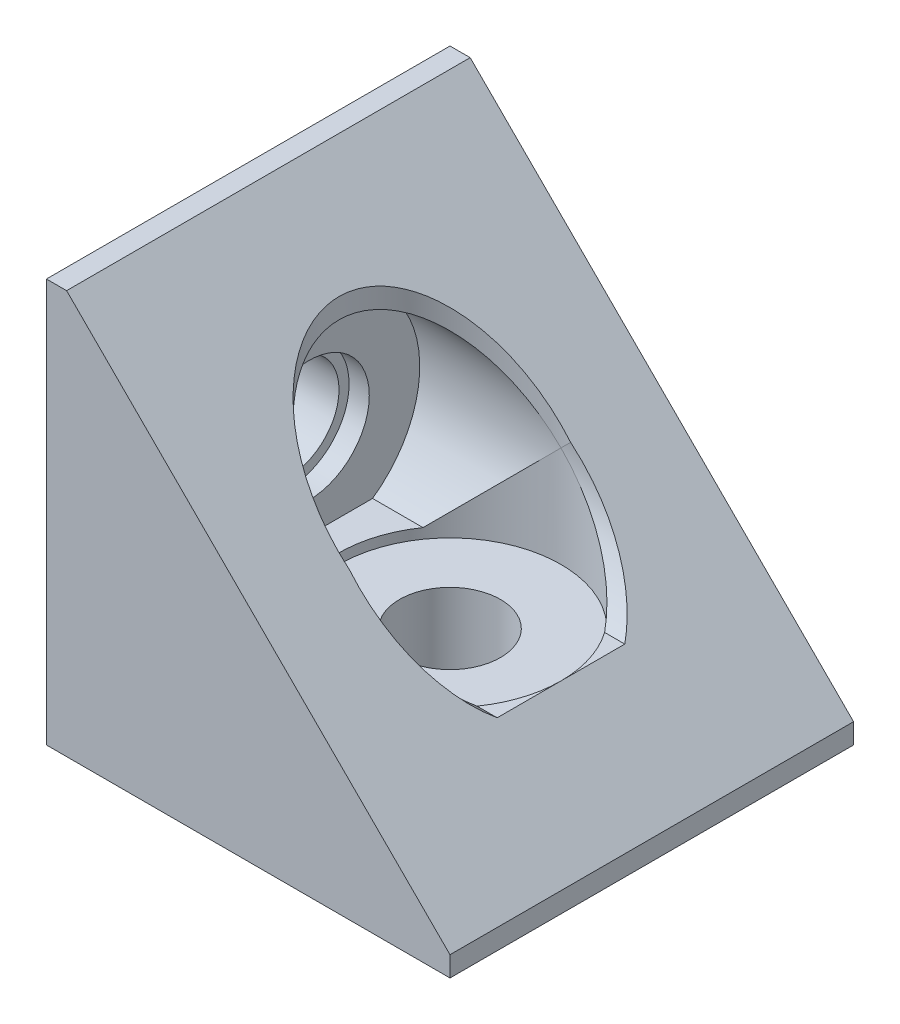
ISO-10303-21;
HEADER;
FILE_DESCRIPTION(('STEP AP214'),'2;1');
FILE_NAME('part.step','',(''),(''),'','','');
FILE_SCHEMA(('AUTOMOTIVE_DESIGN { 1 0 10303 214 1 1 1 1 }'));
ENDSEC;
DATA;
#1=APPLICATION_CONTEXT('core data for automotive mechanical design processes');
#2=APPLICATION_PROTOCOL_DEFINITION('international standard','automotive_design',2000,#1);
#3=PRODUCT_CONTEXT('',#1,'mechanical');
#4=PRODUCT('Part','Part','',(#3));
#5=PRODUCT_RELATED_PRODUCT_CATEGORY('part','',(#4));
#6=PRODUCT_DEFINITION_FORMATION('','',#4);
#7=PRODUCT_DEFINITION_CONTEXT('part definition',#1,'design');
#8=PRODUCT_DEFINITION('design','',#6,#7);
#9=PRODUCT_DEFINITION_SHAPE('','',#8);
#10=(LENGTH_UNIT() NAMED_UNIT(*) SI_UNIT(.MILLI.,.METRE.));
#11=(NAMED_UNIT(*) PLANE_ANGLE_UNIT() SI_UNIT($,.RADIAN.));
#12=(NAMED_UNIT(*) SI_UNIT($,.STERADIAN.) SOLID_ANGLE_UNIT());
#13=UNCERTAINTY_MEASURE_WITH_UNIT(LENGTH_MEASURE(1.E-05),#10,'distance_accuracy_value','');
#14=(GEOMETRIC_REPRESENTATION_CONTEXT(3) GLOBAL_UNCERTAINTY_ASSIGNED_CONTEXT((#13)) GLOBAL_UNIT_ASSIGNED_CONTEXT((#10,
#11,#12)) REPRESENTATION_CONTEXT('',''));
#15=CARTESIAN_POINT('',(0.,0.,0.));
#16=DIRECTION('',(0.,0.,1.));
#17=DIRECTION('',(1.,0.,0.));
#18=AXIS2_PLACEMENT_3D('',#15,#16,#17);
#19=CARTESIAN_POINT('',(0.,20.,20.));
#20=DIRECTION('',(1.,0.,0.));
#21=DIRECTION('',(0.,1.,0.));
#22=AXIS2_PLACEMENT_3D('',#19,#20,#21);
#23=PLANE('',#22);
#24=CARTESIAN_POINT('',(0.,10.,10.));
#25=DIRECTION('',(1.,0.,0.));
#26=DIRECTION('',(0.,1.,0.));
#27=AXIS2_PLACEMENT_3D('',#24,#25,#26);
#28=CIRCLE('',#27,2.5);
#29=CARTESIAN_POINT('',(0.,12.5,10.));
#30=VERTEX_POINT('',#29);
#31=EDGE_CURVE('E43',#30,#30,#28,.T.);
#32=ORIENTED_EDGE('',*,*,#31,.T.);
#33=EDGE_LOOP('',(#32));
#34=FACE_BOUND('',#33,.T.);
#35=DIRECTION('',(0.,-1.,0.));
#36=VECTOR('',#35,1.);
#37=CARTESIAN_POINT('',(0.,20.,0.));
#38=LINE('',#37,#36);
#39=CARTESIAN_POINT('',(0.,20.,0.));
#40=VERTEX_POINT('',#39);
#41=CARTESIAN_POINT('',(0.,0.,0.));
#42=VERTEX_POINT('',#41);
#43=EDGE_CURVE('E176',#40,#42,#38,.T.);
#44=ORIENTED_EDGE('',*,*,#43,.T.);
#45=DIRECTION('',(0.,0.,-1.));
#46=VECTOR('',#45,1.);
#47=CARTESIAN_POINT('',(0.,0.,20.));
#48=LINE('',#47,#46);
#49=CARTESIAN_POINT('',(0.,0.,20.));
#50=VERTEX_POINT('',#49);
#51=EDGE_CURVE('E197',#50,#42,#48,.T.);
#52=ORIENTED_EDGE('',*,*,#51,.F.);
#53=DIRECTION('',(0.,-1.,0.));
#54=VECTOR('',#53,1.);
#55=CARTESIAN_POINT('',(0.,20.,20.));
#56=LINE('',#55,#54);
#57=CARTESIAN_POINT('',(0.,20.,20.));
#58=VERTEX_POINT('',#57);
#59=EDGE_CURVE('E163',#58,#50,#56,.T.);
#60=ORIENTED_EDGE('',*,*,#59,.F.);
#61=DIRECTION('',(0.,0.,-1.));
#62=VECTOR('',#61,1.);
#63=CARTESIAN_POINT('',(0.,20.,20.));
#64=LINE('',#63,#62);
#65=EDGE_CURVE('E175',#58,#40,#64,.T.);
#66=ORIENTED_EDGE('',*,*,#65,.T.);
#67=EDGE_LOOP('',(#44,#52,#60,#66));
#68=FACE_BOUND('',#67,.T.);
#69=ADVANCED_FACE('F40',(#34,#68),#23,.F.);
#70=CARTESIAN_POINT('',(0.,0.,20.));
#71=DIRECTION('',(0.,1.,0.));
#72=DIRECTION('',(0.,0.,1.));
#73=AXIS2_PLACEMENT_3D('',#70,#71,#72);
#74=PLANE('',#73);
#75=CARTESIAN_POINT('',(10.,0.,10.));
#76=DIRECTION('',(0.,1.,0.));
#77=DIRECTION('',(0.,0.,1.));
#78=AXIS2_PLACEMENT_3D('',#75,#76,#77);
#79=CIRCLE('',#78,2.5);
#80=CARTESIAN_POINT('',(10.,0.,12.5));
#81=VERTEX_POINT('',#80);
#82=EDGE_CURVE('E142',#81,#81,#79,.T.);
#83=ORIENTED_EDGE('',*,*,#82,.T.);
#84=EDGE_LOOP('',(#83));
#85=FACE_BOUND('',#84,.T.);
#86=DIRECTION('',(1.,0.,0.));
#87=VECTOR('',#86,1.);
#88=CARTESIAN_POINT('',(0.,0.,0.));
#89=LINE('',#88,#87);
#90=CARTESIAN_POINT('',(20.,0.,0.));
#91=VERTEX_POINT('',#90);
#92=EDGE_CURVE('E179',#42,#91,#89,.T.);
#93=ORIENTED_EDGE('',*,*,#92,.T.);
#94=DIRECTION('',(0.,0.,-1.));
#95=VECTOR('',#94,1.);
#96=CARTESIAN_POINT('',(20.,0.,20.));
#97=LINE('',#96,#95);
#98=CARTESIAN_POINT('',(20.,0.,20.));
#99=VERTEX_POINT('',#98);
#100=EDGE_CURVE('E194',#99,#91,#97,.T.);
#101=ORIENTED_EDGE('',*,*,#100,.F.);
#102=DIRECTION('',(1.,0.,0.));
#103=VECTOR('',#102,1.);
#104=CARTESIAN_POINT('',(0.,0.,20.));
#105=LINE('',#104,#103);
#106=EDGE_CURVE('E166',#50,#99,#105,.T.);
#107=ORIENTED_EDGE('',*,*,#106,.F.);
#108=ORIENTED_EDGE('',*,*,#51,.T.);
#109=EDGE_LOOP('',(#93,#101,#107,#108));
#110=FACE_BOUND('',#109,.T.);
#111=ADVANCED_FACE('F248',(#85,#110),#74,.F.);
#112=CARTESIAN_POINT('',(20.,0.,20.));
#113=DIRECTION('',(-1.,0.,0.));
#114=DIRECTION('',(0.,0.,1.));
#115=AXIS2_PLACEMENT_3D('',#112,#113,#114);
#116=PLANE('',#115);
#117=DIRECTION('',(0.,1.,0.));
#118=VECTOR('',#117,1.);
#119=CARTESIAN_POINT('',(20.,0.,0.));
#120=LINE('',#119,#118);
#121=CARTESIAN_POINT('',(20.,1.,0.));
#122=VERTEX_POINT('',#121);
#123=EDGE_CURVE('E181',#91,#122,#120,.T.);
#124=ORIENTED_EDGE('',*,*,#123,.T.);
#125=DIRECTION('',(0.,0.,-1.));
#126=VECTOR('',#125,1.);
#127=CARTESIAN_POINT('',(20.,1.,20.));
#128=LINE('',#127,#126);
#129=CARTESIAN_POINT('',(20.,1.,20.));
#130=VERTEX_POINT('',#129);
#131=EDGE_CURVE('E191',#130,#122,#128,.T.);
#132=ORIENTED_EDGE('',*,*,#131,.F.);
#133=DIRECTION('',(0.,1.,0.));
#134=VECTOR('',#133,1.);
#135=CARTESIAN_POINT('',(20.,0.,20.));
#136=LINE('',#135,#134);
#137=EDGE_CURVE('E169',#99,#130,#136,.T.);
#138=ORIENTED_EDGE('',*,*,#137,.F.);
#139=ORIENTED_EDGE('',*,*,#100,.T.);
#140=EDGE_LOOP('',(#124,#132,#138,#139));
#141=FACE_BOUND('',#140,.T.);
#142=ADVANCED_FACE('F253',(#141),#116,.F.);
#143=CARTESIAN_POINT('',(20.,1.,20.));
#144=DIRECTION('',(-0.707106781186548,-0.707106781186548,0.));
#145=DIRECTION('',(0.707106781186548,-0.707106781186548,0.));
#146=AXIS2_PLACEMENT_3D('',#143,#144,#145);
#147=PLANE('',#146);
#148=DIRECTION('',(0.,0.,1.));
#149=VECTOR('',#148,1.);
#150=CARTESIAN_POINT('',(15.5,5.5,20.));
#151=LINE('',#150,#149);
#152=CARTESIAN_POINT('',(15.5,5.5,10.));
#153=VERTEX_POINT('',#152);
#154=CARTESIAN_POINT('',(15.5,5.5,13.1622776601684));
#155=VERTEX_POINT('',#154);
#156=EDGE_CURVE('E150',#153,#155,#151,.T.);
#157=ORIENTED_EDGE('',*,*,#156,.T.);
#158=CARTESIAN_POINT('',(11.,10.,10.));
#159=DIRECTION('',(-0.707106781186548,-0.707106781186548,0.));
#160=DIRECTION('',(0.707106781186548,-0.707106781186548,0.));
#161=AXIS2_PLACEMENT_3D('',#158,#159,#160);
#162=ELLIPSE('',#161,7.77817459305203,5.5);
#163=CARTESIAN_POINT('',(10.5,10.5,15.4772255750517));
#164=VERTEX_POINT('',#163);
#165=EDGE_CURVE('E155',#155,#164,#162,.T.);
#166=ORIENTED_EDGE('',*,*,#165,.T.);
#167=CARTESIAN_POINT('',(10.,11.,10.));
#168=DIRECTION('',(-0.707106781186548,-0.707106781186548,0.));
#169=DIRECTION('',(-0.707106781186548,0.707106781186548,0.));
#170=AXIS2_PLACEMENT_3D('',#167,#168,#169);
#171=ELLIPSE('',#170,7.77817459305202,5.5);
#172=CARTESIAN_POINT('',(10.5,10.5,4.52277442494834));
#173=VERTEX_POINT('',#172);
#174=EDGE_CURVE('E162',#164,#173,#171,.T.);
#175=ORIENTED_EDGE('',*,*,#174,.T.);
#176=CARTESIAN_POINT('',(15.5,5.5,6.83772233983162));
#177=VERTEX_POINT('',#176);
#178=EDGE_CURVE('E158',#173,#177,#162,.T.);
#179=ORIENTED_EDGE('',*,*,#178,.T.);
#180=EDGE_CURVE('E154',#177,#153,#151,.T.);
#181=ORIENTED_EDGE('',*,*,#180,.T.);
#182=EDGE_LOOP('',(#157,#166,#175,#179,#181));
#183=FACE_BOUND('',#182,.T.);
#184=DIRECTION('',(-0.707106781186548,0.707106781186548,0.));
#185=VECTOR('',#184,1.);
#186=CARTESIAN_POINT('',(20.,1.,0.));
#187=LINE('',#186,#185);
#188=CARTESIAN_POINT('',(1.,20.,0.));
#189=VERTEX_POINT('',#188);
#190=EDGE_CURVE('E183',#122,#189,#187,.T.);
#191=ORIENTED_EDGE('',*,*,#190,.T.);
#192=DIRECTION('',(0.,0.,-1.));
#193=VECTOR('',#192,1.);
#194=CARTESIAN_POINT('',(1.,20.,20.));
#195=LINE('',#194,#193);
#196=CARTESIAN_POINT('',(1.,20.,20.));
#197=VERTEX_POINT('',#196);
#198=EDGE_CURVE('E188',#197,#189,#195,.T.);
#199=ORIENTED_EDGE('',*,*,#198,.F.);
#200=DIRECTION('',(-0.707106781186548,0.707106781186548,0.));
#201=VECTOR('',#200,1.);
#202=CARTESIAN_POINT('',(20.,1.,20.));
#203=LINE('',#202,#201);
#204=EDGE_CURVE('E171',#130,#197,#203,.T.);
#205=ORIENTED_EDGE('',*,*,#204,.F.);
#206=ORIENTED_EDGE('',*,*,#131,.T.);
#207=EDGE_LOOP('',(#191,#199,#205,#206));
#208=FACE_BOUND('',#207,.T.);
#209=ADVANCED_FACE('F225',(#183,#208),#147,.F.);
#210=CARTESIAN_POINT('',(1.,20.,20.));
#211=DIRECTION('',(0.,-1.,0.));
#212=DIRECTION('',(0.,0.,-1.));
#213=AXIS2_PLACEMENT_3D('',#210,#211,#212);
#214=PLANE('',#213);
#215=DIRECTION('',(-1.,0.,0.));
#216=VECTOR('',#215,1.);
#217=CARTESIAN_POINT('',(1.,20.,0.));
#218=LINE('',#217,#216);
#219=EDGE_CURVE('E167',#189,#40,#218,.T.);
#220=ORIENTED_EDGE('',*,*,#219,.T.);
#221=ORIENTED_EDGE('',*,*,#65,.F.);
#222=DIRECTION('',(-1.,0.,0.));
#223=VECTOR('',#222,1.);
#224=CARTESIAN_POINT('',(1.,20.,20.));
#225=LINE('',#224,#223);
#226=EDGE_CURVE('E173',#197,#58,#225,.T.);
#227=ORIENTED_EDGE('',*,*,#226,.F.);
#228=ORIENTED_EDGE('',*,*,#198,.T.);
#229=EDGE_LOOP('',(#220,#221,#227,#228));
#230=FACE_BOUND('',#229,.T.);
#231=ADVANCED_FACE('F276',(#230),#214,.F.);
#232=CARTESIAN_POINT('',(0.,0.,20.));
#233=DIRECTION('',(0.,0.,1.));
#234=DIRECTION('',(1.,0.,0.));
#235=AXIS2_PLACEMENT_3D('',#232,#233,#234);
#236=PLANE('',#235);
#237=ORIENTED_EDGE('',*,*,#59,.T.);
#238=ORIENTED_EDGE('',*,*,#106,.T.);
#239=ORIENTED_EDGE('',*,*,#137,.T.);
#240=ORIENTED_EDGE('',*,*,#204,.T.);
#241=ORIENTED_EDGE('',*,*,#226,.T.);
#242=EDGE_LOOP('',(#237,#238,#239,#240,#241));
#243=FACE_BOUND('',#242,.T.);
#244=ADVANCED_FACE('F271',(#243),#236,.T.);
#245=CARTESIAN_POINT('',(0.,0.,0.));
#246=DIRECTION('',(0.,0.,1.));
#247=DIRECTION('',(1.,0.,0.));
#248=AXIS2_PLACEMENT_3D('',#245,#246,#247);
#249=PLANE('',#248);
#250=ORIENTED_EDGE('',*,*,#43,.F.);
#251=ORIENTED_EDGE('',*,*,#219,.F.);
#252=ORIENTED_EDGE('',*,*,#190,.F.);
#253=ORIENTED_EDGE('',*,*,#123,.F.);
#254=ORIENTED_EDGE('',*,*,#92,.F.);
#255=EDGE_LOOP('',(#250,#251,#252,#253,#254));
#256=FACE_BOUND('',#255,.T.);
#257=ADVANCED_FACE('F264',(#256),#249,.F.);
#258=CARTESIAN_POINT('',(10.,5.,10.));
#259=DIRECTION('',(0.,1.,0.));
#260=DIRECTION('',(0.,0.,1.));
#261=AXIS2_PLACEMENT_3D('',#258,#259,#260);
#262=CYLINDRICAL_SURFACE('',#261,5.5);
#263=CARTESIAN_POINT('',(10.,10.,10.));
#264=DIRECTION('',(0.707106781186547,0.707106781186547,0.));
#265=DIRECTION('',(-0.707106781186547,0.707106781186547,0.));
#266=AXIS2_PLACEMENT_3D('',#263,#264,#265);
#267=ELLIPSE('',#266,7.77817459305202,5.5);
#268=CARTESIAN_POINT('',(10.,10.,15.5));
#269=VERTEX_POINT('',#268);
#270=CARTESIAN_POINT('',(10.,10.,4.5));
#271=VERTEX_POINT('',#270);
#272=EDGE_CURVE('E211',#269,#271,#267,.F.);
#273=ORIENTED_EDGE('',*,*,#272,.T.);
#274=CARTESIAN_POINT('',(10.,10.,10.));
#275=DIRECTION('',(-0.707106781186547,0.707106781186547,0.));
#276=DIRECTION('',(0.707106781186547,0.707106781186547,0.));
#277=AXIS2_PLACEMENT_3D('',#274,#275,#276);
#278=ELLIPSE('',#277,7.77817459305202,5.5);
#279=EDGE_CURVE('E55',#271,#173,#278,.F.);
#280=ORIENTED_EDGE('',*,*,#279,.T.);
#281=ORIENTED_EDGE('',*,*,#174,.F.);
#282=EDGE_CURVE('E214',#164,#269,#278,.F.);
#283=ORIENTED_EDGE('',*,*,#282,.T.);
#284=EDGE_LOOP('',(#273,#280,#281,#283));
#285=FACE_BOUND('',#284,.T.);
#286=ADVANCED_FACE('F232',(#285),#262,.F.);
#287=CARTESIAN_POINT('',(3.,5.5,13.1622776601684));
#288=DIRECTION('',(0.,-1.,0.));
#289=DIRECTION('',(0.,0.,-1.));
#290=AXIS2_PLACEMENT_3D('',#287,#288,#289);
#291=PLANE('',#290);
#292=DIRECTION('',(1.,0.,0.));
#293=VECTOR('',#292,1.);
#294=CARTESIAN_POINT('',(3.,5.5,6.83772233983162));
#295=LINE('',#294,#293);
#296=CARTESIAN_POINT('',(14.5,5.5,6.83772233983162));
#297=VERTEX_POINT('',#296);
#298=EDGE_CURVE('E136',#297,#177,#295,.T.);
#299=ORIENTED_EDGE('',*,*,#298,.F.);
#300=CARTESIAN_POINT('',(10.,5.5,10.));
#301=DIRECTION('',(0.,-1.,0.));
#302=DIRECTION('',(0.,0.,-1.));
#303=AXIS2_PLACEMENT_3D('',#300,#301,#302);
#304=CIRCLE('',#303,5.5);
#305=EDGE_CURVE('E200',#153,#297,#304,.F.);
#306=ORIENTED_EDGE('',*,*,#305,.F.);
#307=ORIENTED_EDGE('',*,*,#180,.F.);
#308=EDGE_LOOP('',(#299,#306,#307));
#309=FACE_BOUND('',#308,.T.);
#310=ADVANCED_FACE('F229',(#309),#291,.F.);
#311=CARTESIAN_POINT('',(3.,10.,10.));
#312=DIRECTION('',(1.,0.,0.));
#313=DIRECTION('',(0.,0.,-1.));
#314=AXIS2_PLACEMENT_3D('',#311,#312,#313);
#315=CYLINDRICAL_SURFACE('',#314,5.5);
#316=ORIENTED_EDGE('',*,*,#298,.T.);
#317=ORIENTED_EDGE('',*,*,#178,.F.);
#318=ORIENTED_EDGE('',*,*,#279,.F.);
#319=CARTESIAN_POINT('',(10.,10.,10.));
#320=DIRECTION('',(0.707106781186547,0.707106781186547,0.));
#321=DIRECTION('',(-0.707106781186547,0.707106781186547,0.));
#322=AXIS2_PLACEMENT_3D('',#319,#320,#321);
#323=ELLIPSE('',#322,7.77817459305202,5.5);
#324=EDGE_CURVE('E207',#297,#271,#323,.T.);
#325=ORIENTED_EDGE('',*,*,#324,.F.);
#326=EDGE_LOOP('',(#316,#317,#318,#325));
#327=FACE_BOUND('',#326,.T.);
#328=ADVANCED_FACE('F230',(#327),#315,.F.);
#329=CARTESIAN_POINT('',(14.5,5.5,13.1622776601684));
#330=VERTEX_POINT('',#329);
#331=EDGE_CURVE('E205',#330,#153,#304,.F.);
#332=ORIENTED_EDGE('',*,*,#331,.F.);
#333=DIRECTION('',(1.,0.,0.));
#334=VECTOR('',#333,1.);
#335=CARTESIAN_POINT('',(3.,5.5,13.1622776601684));
#336=LINE('',#335,#334);
#337=EDGE_CURVE('E137',#330,#155,#336,.T.);
#338=ORIENTED_EDGE('',*,*,#337,.T.);
#339=ORIENTED_EDGE('',*,*,#156,.F.);
#340=EDGE_LOOP('',(#332,#338,#339));
#341=FACE_BOUND('',#340,.T.);
#342=ADVANCED_FACE('F236',(#341),#291,.F.);
#343=ORIENTED_EDGE('',*,*,#282,.F.);
#344=ORIENTED_EDGE('',*,*,#165,.F.);
#345=ORIENTED_EDGE('',*,*,#337,.F.);
#346=EDGE_CURVE('E210',#269,#330,#323,.T.);
#347=ORIENTED_EDGE('',*,*,#346,.F.);
#348=EDGE_LOOP('',(#343,#344,#345,#347));
#349=FACE_BOUND('',#348,.T.);
#350=ADVANCED_FACE('F235',(#349),#315,.F.);
#351=CARTESIAN_POINT('',(10.,10.,10.));
#352=DIRECTION('',(-0.707106781186547,0.707106781186547,0.));
#353=DIRECTION('',(0.707106781186547,0.707106781186547,0.));
#354=AXIS2_PLACEMENT_3D('',#351,#352,#353);
#355=ELLIPSE('',#354,7.77817459305202,5.5);
#356=CARTESIAN_POINT('',(5.5,5.5,13.1622776601684));
#357=VERTEX_POINT('',#356);
#358=EDGE_CURVE('E48',#357,#269,#355,.T.);
#359=ORIENTED_EDGE('',*,*,#358,.F.);
#360=CARTESIAN_POINT('',(3.,5.5,13.1622776601684));
#361=VERTEX_POINT('',#360);
#362=EDGE_CURVE('E127',#361,#357,#336,.T.);
#363=ORIENTED_EDGE('',*,*,#362,.F.);
#364=CARTESIAN_POINT('',(3.,10.,10.));
#365=DIRECTION('',(1.,0.,0.));
#366=DIRECTION('',(0.,0.,-1.));
#367=AXIS2_PLACEMENT_3D('',#364,#365,#366);
#368=CIRCLE('',#367,5.5);
#369=CARTESIAN_POINT('',(3.,5.5,6.83772233983162));
#370=VERTEX_POINT('',#369);
#371=EDGE_CURVE('E131',#370,#361,#368,.T.);
#372=ORIENTED_EDGE('',*,*,#371,.F.);
#373=CARTESIAN_POINT('',(5.5,5.5,6.83772233983162));
#374=VERTEX_POINT('',#373);
#375=EDGE_CURVE('E145',#370,#374,#295,.T.);
#376=ORIENTED_EDGE('',*,*,#375,.T.);
#377=EDGE_CURVE('E11',#271,#374,#355,.T.);
#378=ORIENTED_EDGE('',*,*,#377,.F.);
#379=ORIENTED_EDGE('',*,*,#272,.F.);
#380=EDGE_LOOP('',(#359,#363,#372,#376,#378,#379));
#381=FACE_BOUND('',#380,.T.);
#382=ADVANCED_FACE('F129',(#381),#315,.F.);
#383=ORIENTED_EDGE('',*,*,#375,.F.);
#384=DIRECTION('',(0.,0.,-1.));
#385=VECTOR('',#384,1.);
#386=CARTESIAN_POINT('',(3.,5.5,13.1622776601684));
#387=LINE('',#386,#385);
#388=EDGE_CURVE('E141',#361,#370,#387,.T.);
#389=ORIENTED_EDGE('',*,*,#388,.F.);
#390=ORIENTED_EDGE('',*,*,#362,.T.);
#391=EDGE_CURVE('E206',#374,#357,#304,.F.);
#392=ORIENTED_EDGE('',*,*,#391,.F.);
#393=EDGE_LOOP('',(#383,#389,#390,#392));
#394=FACE_BOUND('',#393,.T.);
#395=ADVANCED_FACE('F144',(#394),#291,.F.);
#396=CARTESIAN_POINT('',(3.,10.,10.));
#397=DIRECTION('',(1.,0.,0.));
#398=DIRECTION('',(0.,0.,-1.));
#399=AXIS2_PLACEMENT_3D('',#396,#397,#398);
#400=PLANE('',#399);
#401=CARTESIAN_POINT('',(3.,10.,10.));
#402=DIRECTION('',(1.,0.,0.));
#403=DIRECTION('',(0.,0.,-1.));
#404=AXIS2_PLACEMENT_3D('',#401,#402,#403);
#405=CIRCLE('',#404,3.);
#406=CARTESIAN_POINT('',(3.,10.,7.00000000000001));
#407=VERTEX_POINT('',#406);
#408=EDGE_CURVE('E318',#407,#407,#405,.T.);
#409=ORIENTED_EDGE('',*,*,#408,.F.);
#410=EDGE_LOOP('',(#409));
#411=FACE_BOUND('',#410,.T.);
#412=ORIENTED_EDGE('',*,*,#371,.T.);
#413=ORIENTED_EDGE('',*,*,#388,.T.);
#414=EDGE_LOOP('',(#412,#413));
#415=FACE_BOUND('',#414,.T.);
#416=ADVANCED_FACE('F140',(#411,#415),#400,.T.);
#417=CARTESIAN_POINT('',(10.,5.,10.));
#418=DIRECTION('',(0.,1.,0.));
#419=DIRECTION('',(0.,0.,1.));
#420=AXIS2_PLACEMENT_3D('',#417,#418,#419);
#421=PLANE('',#420);
#422=CARTESIAN_POINT('',(10.,5.,10.));
#423=DIRECTION('',(0.,1.,0.));
#424=DIRECTION('',(0.,0.,1.));
#425=AXIS2_PLACEMENT_3D('',#422,#423,#424);
#426=CIRCLE('',#425,2.5);
#427=CARTESIAN_POINT('',(10.,5.,12.5));
#428=VERTEX_POINT('',#427);
#429=EDGE_CURVE('E306',#428,#428,#426,.T.);
#430=ORIENTED_EDGE('',*,*,#429,.F.);
#431=EDGE_LOOP('',(#430));
#432=FACE_BOUND('',#431,.T.);
#433=CARTESIAN_POINT('',(10.,5.,10.));
#434=DIRECTION('',(0.,1.,0.));
#435=DIRECTION('',(0.,0.,1.));
#436=AXIS2_PLACEMENT_3D('',#433,#434,#435);
#437=CIRCLE('',#436,5.5);
#438=CARTESIAN_POINT('',(10.,5.,15.5));
#439=VERTEX_POINT('',#438);
#440=EDGE_CURVE('E159',#439,#439,#437,.T.);
#441=ORIENTED_EDGE('',*,*,#440,.T.);
#442=EDGE_LOOP('',(#441));
#443=FACE_BOUND('',#442,.T.);
#444=ADVANCED_FACE('F294',(#432,#443),#421,.T.);
#445=ORIENTED_EDGE('',*,*,#324,.T.);
#446=ORIENTED_EDGE('',*,*,#377,.T.);
#447=ORIENTED_EDGE('',*,*,#391,.T.);
#448=ORIENTED_EDGE('',*,*,#358,.T.);
#449=ORIENTED_EDGE('',*,*,#346,.T.);
#450=ORIENTED_EDGE('',*,*,#331,.T.);
#451=ORIENTED_EDGE('',*,*,#305,.T.);
#452=EDGE_LOOP('',(#445,#446,#447,#448,#449,#450,#451));
#453=FACE_BOUND('',#452,.T.);
#454=ORIENTED_EDGE('',*,*,#440,.F.);
#455=EDGE_LOOP('',(#454));
#456=FACE_BOUND('',#455,.T.);
#457=ADVANCED_FACE('F218',(#453,#456),#262,.F.);
#458=CARTESIAN_POINT('',(10.,5.,10.));
#459=DIRECTION('',(0.,1.,0.));
#460=DIRECTION('',(0.,0.,1.));
#461=AXIS2_PLACEMENT_3D('',#458,#459,#460);
#462=CYLINDRICAL_SURFACE('',#461,2.5);
#463=ORIENTED_EDGE('',*,*,#82,.F.);
#464=EDGE_LOOP('',(#463));
#465=FACE_BOUND('',#464,.T.);
#466=ORIENTED_EDGE('',*,*,#429,.T.);
#467=EDGE_LOOP('',(#466));
#468=FACE_BOUND('',#467,.T.);
#469=ADVANCED_FACE('F301',(#465,#468),#462,.F.);
#470=CARTESIAN_POINT('',(3.,10.,10.));
#471=DIRECTION('',(1.,0.,0.));
#472=DIRECTION('',(0.,0.,-1.));
#473=AXIS2_PLACEMENT_3D('',#470,#471,#472);
#474=CYLINDRICAL_SURFACE('',#473,2.5);
#475=CARTESIAN_POINT('',(2.,10.,10.));
#476=DIRECTION('',(1.,0.,0.));
#477=DIRECTION('',(0.,0.,-1.));
#478=AXIS2_PLACEMENT_3D('',#475,#476,#477);
#479=CIRCLE('',#478,2.5);
#480=CARTESIAN_POINT('',(2.,10.,7.50000000000001));
#481=VERTEX_POINT('',#480);
#482=EDGE_CURVE('E311',#481,#481,#479,.T.);
#483=ORIENTED_EDGE('',*,*,#482,.T.);
#484=EDGE_LOOP('',(#483));
#485=FACE_BOUND('',#484,.T.);
#486=ORIENTED_EDGE('',*,*,#31,.F.);
#487=EDGE_LOOP('',(#486));
#488=FACE_BOUND('',#487,.T.);
#489=ADVANCED_FACE('F330',(#485,#488),#474,.F.);
#490=CARTESIAN_POINT('',(2.,12.5,10.));
#491=DIRECTION('',(-1.,0.,0.));
#492=DIRECTION('',(0.,0.,1.));
#493=AXIS2_PLACEMENT_3D('',#490,#491,#492);
#494=PLANE('',#493);
#495=ORIENTED_EDGE('',*,*,#482,.F.);
#496=EDGE_LOOP('',(#495));
#497=FACE_BOUND('',#496,.T.);
#498=CARTESIAN_POINT('',(2.,10.,10.));
#499=DIRECTION('',(1.,0.,0.));
#500=DIRECTION('',(0.,0.,-1.));
#501=AXIS2_PLACEMENT_3D('',#498,#499,#500);
#502=CIRCLE('',#501,3.);
#503=CARTESIAN_POINT('',(2.,10.,7.00000000000001));
#504=VERTEX_POINT('',#503);
#505=EDGE_CURVE('E315',#504,#504,#502,.T.);
#506=ORIENTED_EDGE('',*,*,#505,.T.);
#507=EDGE_LOOP('',(#506));
#508=FACE_BOUND('',#507,.T.);
#509=ADVANCED_FACE('F324',(#497,#508),#494,.F.);
#510=CARTESIAN_POINT('',(3.,10.,10.));
#511=DIRECTION('',(1.,0.,0.));
#512=DIRECTION('',(0.,0.,-1.));
#513=AXIS2_PLACEMENT_3D('',#510,#511,#512);
#514=CYLINDRICAL_SURFACE('',#513,3.);
#515=ORIENTED_EDGE('',*,*,#505,.F.);
#516=EDGE_LOOP('',(#515));
#517=FACE_BOUND('',#516,.T.);
#518=ORIENTED_EDGE('',*,*,#408,.T.);
#519=EDGE_LOOP('',(#518));
#520=FACE_BOUND('',#519,.T.);
#521=ADVANCED_FACE('F322',(#517,#520),#514,.F.);
#522=CLOSED_SHELL('',(#69,#111,#142,#209,#231,#244,#257,#286,#310,#328,#342,#350,#382,#395,#416,
#444,#457,#469,#489,#509,#521));
#523=MANIFOLD_SOLID_BREP('B2',#522);
#524=ADVANCED_BREP_SHAPE_REPRESENTATION('',(#18,#523),#14);
#525=SHAPE_DEFINITION_REPRESENTATION(#9,#524);
ENDSEC;
END-ISO-10303-21;
